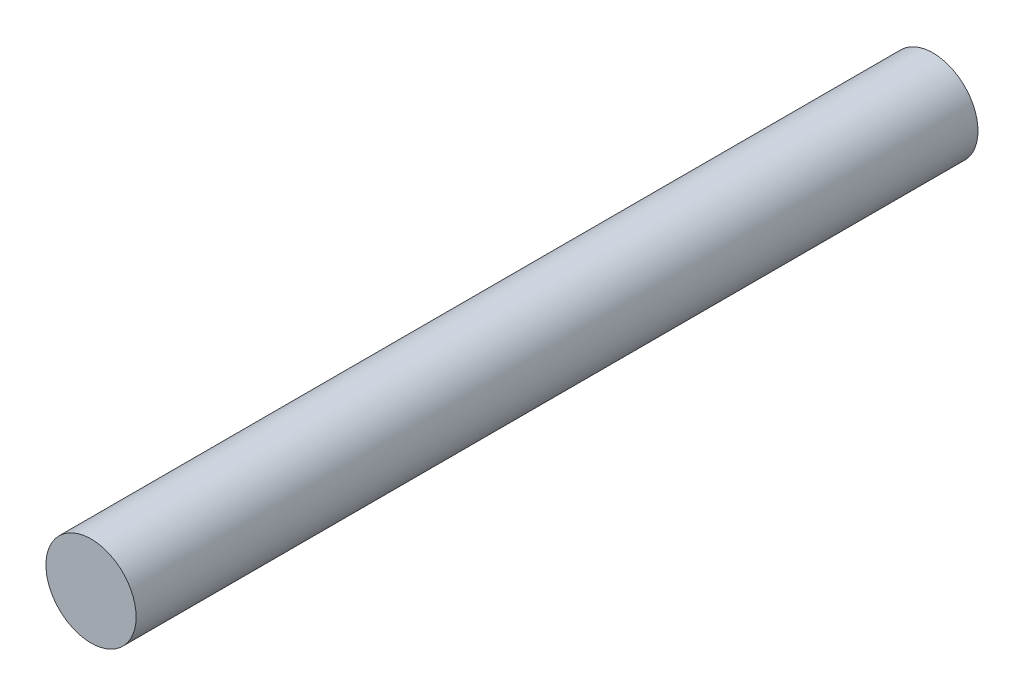
ISO-10303-21;
HEADER;
FILE_DESCRIPTION(('STEP AP214'),'2;1');
FILE_NAME('part.step','',(''),(''),'','','');
FILE_SCHEMA(('AUTOMOTIVE_DESIGN { 1 0 10303 214 1 1 1 1 }'));
ENDSEC;
DATA;
#1=APPLICATION_CONTEXT('core data for automotive mechanical design processes');
#2=APPLICATION_PROTOCOL_DEFINITION('international standard','automotive_design',2000,#1);
#3=PRODUCT_CONTEXT('',#1,'mechanical');
#4=PRODUCT('Part','Part','',(#3));
#5=PRODUCT_RELATED_PRODUCT_CATEGORY('part','',(#4));
#6=PRODUCT_DEFINITION_FORMATION('','',#4);
#7=PRODUCT_DEFINITION_CONTEXT('part definition',#1,'design');
#8=PRODUCT_DEFINITION('design','',#6,#7);
#9=PRODUCT_DEFINITION_SHAPE('','',#8);
#10=(LENGTH_UNIT() NAMED_UNIT(*) SI_UNIT(.MILLI.,.METRE.));
#11=(NAMED_UNIT(*) PLANE_ANGLE_UNIT() SI_UNIT($,.RADIAN.));
#12=(NAMED_UNIT(*) SI_UNIT($,.STERADIAN.) SOLID_ANGLE_UNIT());
#13=UNCERTAINTY_MEASURE_WITH_UNIT(LENGTH_MEASURE(1.E-05),#10,'distance_accuracy_value','');
#14=(GEOMETRIC_REPRESENTATION_CONTEXT(3) GLOBAL_UNCERTAINTY_ASSIGNED_CONTEXT((#13)) GLOBAL_UNIT_ASSIGNED_CONTEXT((#10,
#11,#12)) REPRESENTATION_CONTEXT('',''));
#15=CARTESIAN_POINT('',(0.,0.,0.));
#16=DIRECTION('',(0.,0.,1.));
#17=DIRECTION('',(1.,0.,0.));
#18=AXIS2_PLACEMENT_3D('',#15,#16,#17);
#19=CARTESIAN_POINT('',(0.,0.,56.));
#20=DIRECTION('',(0.,0.,-1.));
#21=DIRECTION('',(-1.,0.,0.));
#22=AXIS2_PLACEMENT_3D('',#19,#20,#21);
#23=CYLINDRICAL_SURFACE('',#22,3.);
#24=CARTESIAN_POINT('',(0.,0.,56.));
#25=DIRECTION('',(0.,0.,1.));
#26=DIRECTION('',(1.,0.,0.));
#27=AXIS2_PLACEMENT_3D('',#24,#25,#26);
#28=CIRCLE('',#27,3.);
#29=CARTESIAN_POINT('',(3.,0.,56.));
#30=VERTEX_POINT('',#29);
#31=EDGE_CURVE('E10',#30,#30,#28,.T.);
#32=ORIENTED_EDGE('',*,*,#31,.F.);
#33=EDGE_LOOP('',(#32));
#34=FACE_BOUND('',#33,.T.);
#35=CARTESIAN_POINT('',(0.,0.,0.));
#36=DIRECTION('',(0.,0.,1.));
#37=DIRECTION('',(1.,0.,0.));
#38=AXIS2_PLACEMENT_3D('',#35,#36,#37);
#39=CIRCLE('',#38,3.);
#40=CARTESIAN_POINT('',(3.,0.,0.));
#41=VERTEX_POINT('',#40);
#42=EDGE_CURVE('E35',#41,#41,#39,.T.);
#43=ORIENTED_EDGE('',*,*,#42,.T.);
#44=EDGE_LOOP('',(#43));
#45=FACE_BOUND('',#44,.T.);
#46=ADVANCED_FACE('F32',(#34,#45),#23,.T.);
#47=CARTESIAN_POINT('',(0.,0.,56.));
#48=DIRECTION('',(0.,0.,1.));
#49=DIRECTION('',(1.,0.,0.));
#50=AXIS2_PLACEMENT_3D('',#47,#48,#49);
#51=PLANE('',#50);
#52=ORIENTED_EDGE('',*,*,#31,.T.);
#53=EDGE_LOOP('',(#52));
#54=FACE_BOUND('',#53,.T.);
#55=ADVANCED_FACE('F47',(#54),#51,.T.);
#56=CARTESIAN_POINT('',(0.,0.,0.));
#57=DIRECTION('',(0.,0.,1.));
#58=DIRECTION('',(1.,0.,0.));
#59=AXIS2_PLACEMENT_3D('',#56,#57,#58);
#60=PLANE('',#59);
#61=ORIENTED_EDGE('',*,*,#42,.F.);
#62=EDGE_LOOP('',(#61));
#63=FACE_BOUND('',#62,.T.);
#64=ADVANCED_FACE('F45',(#63),#60,.F.);
#65=CLOSED_SHELL('',(#46,#55,#64));
#66=MANIFOLD_SOLID_BREP('B2',#65);
#67=ADVANCED_BREP_SHAPE_REPRESENTATION('',(#18,#66),#14);
#68=SHAPE_DEFINITION_REPRESENTATION(#9,#67);
ENDSEC;
END-ISO-10303-21;
